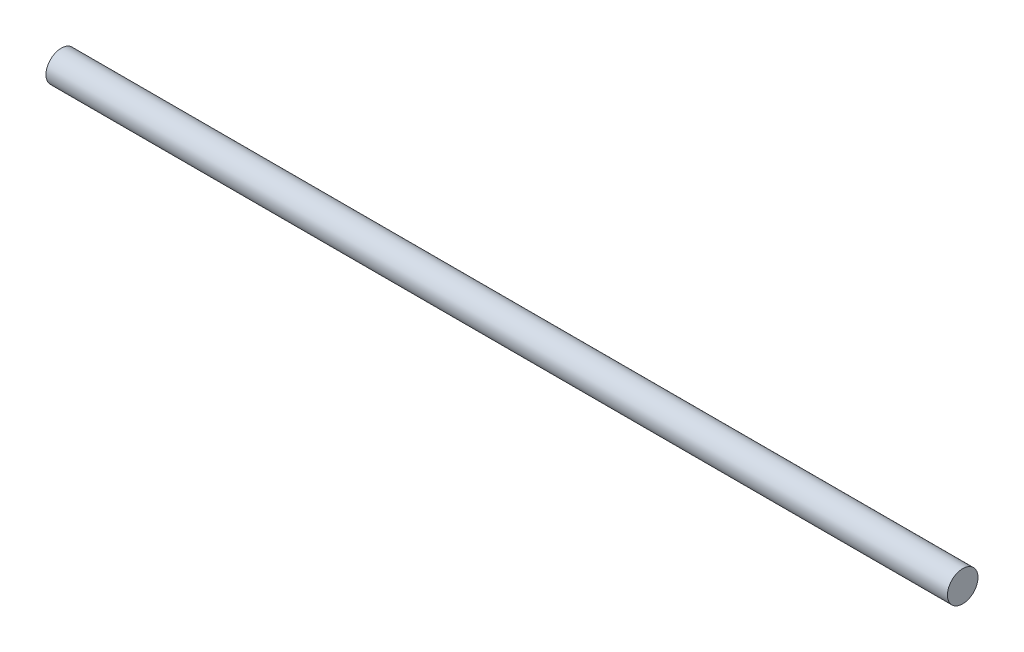
ISO-10303-21;
HEADER;
FILE_DESCRIPTION(('STEP AP214'),'2;1');
FILE_NAME('part.step','',(''),(''),'','','');
FILE_SCHEMA(('AUTOMOTIVE_DESIGN { 1 0 10303 214 1 1 1 1 }'));
ENDSEC;
DATA;
#1=APPLICATION_CONTEXT('core data for automotive mechanical design processes');
#2=APPLICATION_PROTOCOL_DEFINITION('international standard','automotive_design',2000,#1);
#3=PRODUCT_CONTEXT('',#1,'mechanical');
#4=PRODUCT('Part','Part','',(#3));
#5=PRODUCT_RELATED_PRODUCT_CATEGORY('part','',(#4));
#6=PRODUCT_DEFINITION_FORMATION('','',#4);
#7=PRODUCT_DEFINITION_CONTEXT('part definition',#1,'design');
#8=PRODUCT_DEFINITION('design','',#6,#7);
#9=PRODUCT_DEFINITION_SHAPE('','',#8);
#10=(LENGTH_UNIT() NAMED_UNIT(*) SI_UNIT(.MILLI.,.METRE.));
#11=(NAMED_UNIT(*) PLANE_ANGLE_UNIT() SI_UNIT($,.RADIAN.));
#12=(NAMED_UNIT(*) SI_UNIT($,.STERADIAN.) SOLID_ANGLE_UNIT());
#13=UNCERTAINTY_MEASURE_WITH_UNIT(LENGTH_MEASURE(1.E-05),#10,'distance_accuracy_value','');
#14=(GEOMETRIC_REPRESENTATION_CONTEXT(3) GLOBAL_UNCERTAINTY_ASSIGNED_CONTEXT((#13)) GLOBAL_UNIT_ASSIGNED_CONTEXT((#10,
#11,#12)) REPRESENTATION_CONTEXT('',''));
#15=CARTESIAN_POINT('',(0.,0.,0.));
#16=DIRECTION('',(0.,0.,1.));
#17=DIRECTION('',(1.,0.,0.));
#18=AXIS2_PLACEMENT_3D('',#15,#16,#17);
#19=CARTESIAN_POINT('',(590.,0.,0.));
#20=DIRECTION('',(-1.,0.,0.));
#21=DIRECTION('',(0.,0.,1.));
#22=AXIS2_PLACEMENT_3D('',#19,#20,#21);
#23=CYLINDRICAL_SURFACE('',#22,10.);
#24=CARTESIAN_POINT('',(590.,0.,0.));
#25=DIRECTION('',(1.,0.,0.));
#26=DIRECTION('',(0.,0.,-1.));
#27=AXIS2_PLACEMENT_3D('',#24,#25,#26);
#28=CIRCLE('',#27,10.);
#29=CARTESIAN_POINT('',(590.,0.,-10.));
#30=VERTEX_POINT('',#29);
#31=EDGE_CURVE('E10',#30,#30,#28,.T.);
#32=ORIENTED_EDGE('',*,*,#31,.F.);
#33=EDGE_LOOP('',(#32));
#34=FACE_BOUND('',#33,.T.);
#35=CARTESIAN_POINT('',(0.,0.,0.));
#36=DIRECTION('',(1.,0.,0.));
#37=DIRECTION('',(0.,0.,-1.));
#38=AXIS2_PLACEMENT_3D('',#35,#36,#37);
#39=CIRCLE('',#38,10.);
#40=CARTESIAN_POINT('',(0.,0.,-10.));
#41=VERTEX_POINT('',#40);
#42=EDGE_CURVE('E31',#41,#41,#39,.T.);
#43=ORIENTED_EDGE('',*,*,#42,.T.);
#44=EDGE_LOOP('',(#43));
#45=FACE_BOUND('',#44,.T.);
#46=ADVANCED_FACE('F28',(#34,#45),#23,.T.);
#47=CARTESIAN_POINT('',(590.,0.,0.));
#48=DIRECTION('',(1.,0.,0.));
#49=DIRECTION('',(0.,0.,-1.));
#50=AXIS2_PLACEMENT_3D('',#47,#48,#49);
#51=PLANE('',#50);
#52=ORIENTED_EDGE('',*,*,#31,.T.);
#53=EDGE_LOOP('',(#52));
#54=FACE_BOUND('',#53,.T.);
#55=ADVANCED_FACE('F43',(#54),#51,.T.);
#56=CARTESIAN_POINT('',(0.,0.,0.));
#57=DIRECTION('',(1.,0.,0.));
#58=DIRECTION('',(0.,0.,-1.));
#59=AXIS2_PLACEMENT_3D('',#56,#57,#58);
#60=PLANE('',#59);
#61=ORIENTED_EDGE('',*,*,#42,.F.);
#62=EDGE_LOOP('',(#61));
#63=FACE_BOUND('',#62,.T.);
#64=ADVANCED_FACE('F41',(#63),#60,.F.);
#65=CLOSED_SHELL('',(#46,#55,#64));
#66=MANIFOLD_SOLID_BREP('B2',#65);
#67=ADVANCED_BREP_SHAPE_REPRESENTATION('',(#18,#66),#14);
#68=SHAPE_DEFINITION_REPRESENTATION(#9,#67);
ENDSEC;
END-ISO-10303-21;
